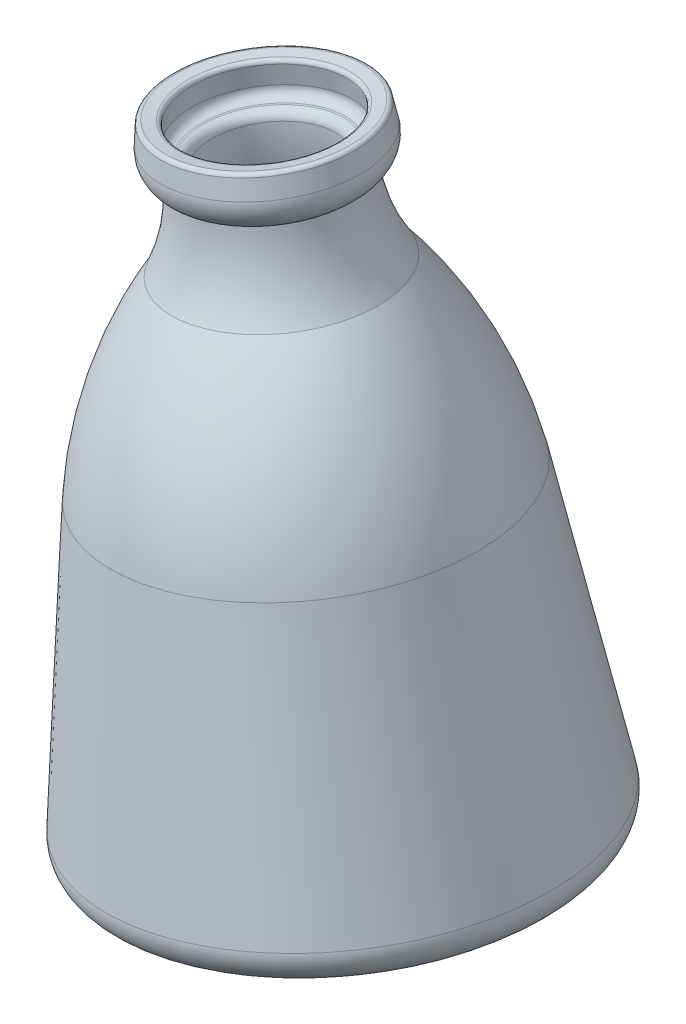
ISO-10303-21;
HEADER;
FILE_DESCRIPTION(('STEP AP214'),'2;1');
FILE_NAME('part.step','',(''),(''),'','','');
FILE_SCHEMA(('AUTOMOTIVE_DESIGN { 1 0 10303 214 1 1 1 1 }'));
ENDSEC;
DATA;
#1=APPLICATION_CONTEXT('core data for automotive mechanical design processes');
#2=APPLICATION_PROTOCOL_DEFINITION('international standard','automotive_design',2000,#1);
#3=PRODUCT_CONTEXT('',#1,'mechanical');
#4=PRODUCT('Part','Part','',(#3));
#5=PRODUCT_RELATED_PRODUCT_CATEGORY('part','',(#4));
#6=PRODUCT_DEFINITION_FORMATION('','',#4);
#7=PRODUCT_DEFINITION_CONTEXT('part definition',#1,'design');
#8=PRODUCT_DEFINITION('design','',#6,#7);
#9=PRODUCT_DEFINITION_SHAPE('','',#8);
#10=(LENGTH_UNIT() NAMED_UNIT(*) SI_UNIT(.MILLI.,.METRE.));
#11=(NAMED_UNIT(*) PLANE_ANGLE_UNIT() SI_UNIT($,.RADIAN.));
#12=(NAMED_UNIT(*) SI_UNIT($,.STERADIAN.) SOLID_ANGLE_UNIT());
#13=UNCERTAINTY_MEASURE_WITH_UNIT(LENGTH_MEASURE(1.E-05),#10,'distance_accuracy_value','');
#14=(GEOMETRIC_REPRESENTATION_CONTEXT(3) GLOBAL_UNCERTAINTY_ASSIGNED_CONTEXT((#13)) GLOBAL_UNIT_ASSIGNED_CONTEXT((#10,
#11,#12)) REPRESENTATION_CONTEXT('',''));
#15=CARTESIAN_POINT('',(0.,0.,0.));
#16=DIRECTION('',(0.,0.,1.));
#17=DIRECTION('',(1.,0.,0.));
#18=AXIS2_PLACEMENT_3D('',#15,#16,#17);
#19=CARTESIAN_POINT('',(39.3370164346481,15.7784016479815,0.));
#20=DIRECTION('',(0.138333615475444,-0.990385687916325,0.));
#21=DIRECTION('',(0.990385687916325,0.138333615475444,0.));
#22=AXIS2_PLACEMENT_3D('',#19,#20,#21);
#23=TOROIDAL_SURFACE('',#22,41.7707465623852,2.);
#24=CARTESIAN_POINT('',(39.0630091687989,17.7401292696405,0.));
#25=DIRECTION('',(0.138333615475444,-0.990385687916325,0.));
#26=DIRECTION('',(0.990385687916325,0.138333615475444,0.));
#27=AXIS2_PLACEMENT_3D('',#24,#25,#26);
#28=CIRCLE('',#27,41.4940793314343);
#29=CARTESIAN_POINT('',(80.158151471916,23.4801552843827,0.));
#30=VERTEX_POINT('',#29);
#31=EDGE_CURVE('E11',#30,#30,#28,.T.);
#32=ORIENTED_EDGE('',*,*,#31,.F.);
#33=EDGE_LOOP('',(#32));
#34=FACE_BOUND('',#33,.T.);
#35=CARTESIAN_POINT('',(39.3752888129891,15.5043943821322,0.));
#36=DIRECTION('',(0.138333615475444,-0.990385687916325,0.));
#37=DIRECTION('',(0.990385687916325,0.138333615475444,0.));
#38=AXIS2_PLACEMENT_3D('',#35,#36,#37);
#39=CIRCLE('',#38,39.7899751865526);
#40=CARTESIAN_POINT('',(78.7827107602964,21.0086855093663,0.));
#41=VERTEX_POINT('',#40);
#42=EDGE_CURVE('E168',#41,#41,#39,.T.);
#43=ORIENTED_EDGE('',*,*,#42,.T.);
#44=EDGE_LOOP('',(#43));
#45=FACE_BOUND('',#44,.T.);
#46=ADVANCED_FACE('F36',(#34,#45),#23,.T.);
#47=CARTESIAN_POINT('',(39.0630091687989,17.7401292696405,0.));
#48=DIRECTION('',(-0.138333615475444,0.990385687916325,0.));
#49=DIRECTION('',(-0.990385687916325,-0.138333615475444,0.));
#50=AXIS2_PLACEMENT_3D('',#47,#48,#49);
#51=CONICAL_SURFACE('',#50,41.4940793314343,1.43201767183175);
#52=CARTESIAN_POINT('',(38.9481920337758,18.5621510671881,0.));
#53=DIRECTION('',(0.138333615475444,-0.990385687916325,0.));
#54=DIRECTION('',(0.990385687916325,0.138333615475444,0.));
#55=AXIS2_PLACEMENT_3D('',#52,#53,#54);
#56=CIRCLE('',#55,47.4363934589323);
#57=CARTESIAN_POINT('',(85.9285172018699,25.1241988794779,0.));
#58=VERTEX_POINT('',#57);
#59=EDGE_CURVE('E43',#58,#58,#56,.T.);
#60=ORIENTED_EDGE('',*,*,#59,.F.);
#61=EDGE_LOOP('',(#60));
#62=FACE_BOUND('',#61,.T.);
#63=ORIENTED_EDGE('',*,*,#31,.T.);
#64=EDGE_LOOP('',(#63));
#65=FACE_BOUND('',#64,.T.);
#66=ADVANCED_FACE('F226',(#62,#65),#51,.F.);
#67=CARTESIAN_POINT('',(39.222199299625,16.6004234455291,0.));
#68=DIRECTION('',(0.138333615475444,-0.990385687916325,0.));
#69=DIRECTION('',(0.990385687916325,0.138333615475444,0.));
#70=AXIS2_PLACEMENT_3D('',#67,#68,#69);
#71=TOROIDAL_SURFACE('',#70,47.7130606898832,2.);
#72=CARTESIAN_POINT('',(39.183926921284,16.8744307113783,0.));
#73=DIRECTION('',(0.138333615475444,-0.990385687916325,0.));
#74=DIRECTION('',(0.990385687916325,0.138333615475444,0.));
#75=AXIS2_PLACEMENT_3D('',#72,#73,#74);
#76=CIRCLE('',#75,49.6938320657158);
#77=CARTESIAN_POINT('',(88.3999869768863,23.7487581678583,0.));
#78=VERTEX_POINT('',#77);
#79=EDGE_CURVE('E219',#78,#78,#76,.T.);
#80=ORIENTED_EDGE('',*,*,#79,.F.);
#81=EDGE_LOOP('',(#80));
#82=FACE_BOUND('',#81,.T.);
#83=ORIENTED_EDGE('',*,*,#59,.T.);
#84=EDGE_LOOP('',(#83));
#85=FACE_BOUND('',#84,.T.);
#86=ADVANCED_FACE('F224',(#82,#85),#71,.T.);
#87=CARTESIAN_POINT('',(39.183926921284,16.8744307113783,0.));
#88=DIRECTION('',(0.138333615475444,-0.990385687916325,0.));
#89=DIRECTION('',(0.990385687916325,0.138333615475444,0.));
#90=AXIS2_PLACEMENT_3D('',#87,#88,#89);
#91=CONICAL_SURFACE('',#90,49.6938320657158,0.13877865496315);
#92=CARTESIAN_POINT('',(40.55396325053,7.06579260308338,0.));
#93=DIRECTION('',(0.138333615475444,-0.990385687916325,0.));
#94=DIRECTION('',(0.990385687916325,0.138333615475444,0.));
#95=AXIS2_PLACEMENT_3D('',#92,#93,#94);
#96=CIRCLE('',#95,51.0771682204702);
#97=CARTESIAN_POINT('',(91.1400596353783,14.1314819512685,0.));
#98=VERTEX_POINT('',#97);
#99=EDGE_CURVE('E216',#98,#98,#96,.T.);
#100=ORIENTED_EDGE('',*,*,#99,.F.);
#101=EDGE_LOOP('',(#100));
#102=FACE_BOUND('',#101,.T.);
#103=ORIENTED_EDGE('',*,*,#79,.T.);
#104=EDGE_LOOP('',(#103));
#105=FACE_BOUND('',#104,.T.);
#106=ADVANCED_FACE('F319',(#102,#105),#91,.T.);
#107=CARTESIAN_POINT('',(40.8410060880876,5.01073810921435,0.));
#108=DIRECTION('',(0.138333615475444,-0.990385687916325,0.));
#109=DIRECTION('',(0.990385687916325,0.138333615475444,0.));
#110=AXIS2_PLACEMENT_3D('',#107,#108,#109);
#111=TOROIDAL_SURFACE('',#110,36.2213829017254,15.);
#112=CARTESIAN_POINT('',(42.7785090361819,-8.86062051531988,0.));
#113=DIRECTION('',(0.138333615475444,-0.990385687916325,0.));
#114=DIRECTION('',(0.990385687916325,0.138333615475444,0.));
#115=AXIS2_PLACEMENT_3D('',#112,#113,#114);
#116=CIRCLE('',#115,41.5908793618865);
#117=CARTESIAN_POINT('',(83.9695207040488,-3.1072038023871,0.));
#118=VERTEX_POINT('',#117);
#119=EDGE_CURVE('E213',#118,#118,#116,.T.);
#120=ORIENTED_EDGE('',*,*,#119,.F.);
#121=EDGE_LOOP('',(#120));
#122=FACE_BOUND('',#121,.T.);
#123=ORIENTED_EDGE('',*,*,#99,.T.);
#124=EDGE_LOOP('',(#123));
#125=FACE_BOUND('',#124,.T.);
#126=ADVANCED_FACE('F315',(#122,#125),#111,.T.);
#127=CARTESIAN_POINT('',(42.4731771639399,-6.67462750636158,0.));
#128=DIRECTION('',(0.138333615475444,-0.990385687916325,0.));
#129=DIRECTION('',(0.990385687916325,0.138333615475444,0.));
#130=AXIS2_PLACEMENT_3D('',#127,#128,#129);
#131=TOROIDAL_SURFACE('',#130,131.563809774387,90.);
#132=CARTESIAN_POINT('',(48.5307409426701,-50.0431496799162,0.));
#133=DIRECTION('',(0.138333615475444,-0.990385687916325,0.));
#134=DIRECTION('',(0.990385687916325,0.138333615475444,0.));
#135=AXIS2_PLACEMENT_3D('',#132,#133,#134);
#136=CIRCLE('',#135,52.9350796209082);
#137=CARTESIAN_POINT('',(100.956886187929,-42.7204487304755,0.));
#138=VERTEX_POINT('',#137);
#139=EDGE_CURVE('E210',#138,#138,#136,.T.);
#140=ORIENTED_EDGE('',*,*,#139,.F.);
#141=EDGE_LOOP('',(#140));
#142=FACE_BOUND('',#141,.T.);
#143=ORIENTED_EDGE('',*,*,#119,.T.);
#144=EDGE_LOOP('',(#143));
#145=FACE_BOUND('',#144,.T.);
#146=ADVANCED_FACE('F311',(#142,#145),#131,.F.);
#147=CARTESIAN_POINT('',(66.2307969395237,-176.764930747751,0.));
#148=DIRECTION('',(0.138333615475444,-0.990385687916325,0.));
#149=DIRECTION('',(0.990385687916325,0.138333615475444,0.));
#150=AXIS2_PLACEMENT_3D('',#147,#148,#149);
#151=DEGENERATE_TOROIDAL_SURFACE('',#150,113.583082213481,210.,.F.);
#152=CARTESIAN_POINT('',(61.6894632029249,-144.251705951878,0.));
#153=DIRECTION('',(0.138333615475444,-0.990385687916325,0.));
#154=DIRECTION('',(0.990385687916325,0.138333615475444,0.));
#155=AXIS2_PLACEMENT_3D('',#152,#153,#154);
#156=CIRCLE('',#155,93.8350136732225);
#157=CARTESIAN_POINT('',(154.622317770317,-131.271169252273,0.));
#158=VERTEX_POINT('',#157);
#159=EDGE_CURVE('E207',#158,#158,#156,.T.);
#160=ORIENTED_EDGE('',*,*,#159,.F.);
#161=EDGE_LOOP('',(#160));
#162=FACE_BOUND('',#161,.T.);
#163=ORIENTED_EDGE('',*,*,#139,.T.);
#164=EDGE_LOOP('',(#163));
#165=FACE_BOUND('',#164,.T.);
#166=ADVANCED_FACE('F307',(#162,#165),#151,.F.);
#167=CARTESIAN_POINT('',(61.6894632029249,-144.251705951878,0.));
#168=DIRECTION('',(0.138333615475444,-0.990385687916325,0.));
#169=DIRECTION('',(0.990385687916325,0.138333615475444,0.));
#170=AXIS2_PLACEMENT_3D('',#167,#168,#169);
#171=CONICAL_SURFACE('',#170,93.8350136732225,0.138778654963151);
#172=CARTESIAN_POINT('',(79.5527487690849,-256.666494732534,-8.93485225696441));
#173=DIRECTION('',(0.,0.866025403784439,-0.499999999999999));
#174=DIRECTION('',(0.269052053439782,-0.481562818472272,-0.834091268630045));
#175=AXIS2_PLACEMENT_3D('',#172,#173,#174);
#176=ELLIPSE('',#175,127.936362662556,109.345591264937);
#177=CARTESIAN_POINT('',(-31.2050662316217,-253.170081953854,-2.87888768005868));
#178=VERTEX_POINT('',#177);
#179=CARTESIAN_POINT('',(-28.8329270824359,-264.717087353855,-22.8788877081311));
#180=VERTEX_POINT('',#179);
#181=EDGE_CURVE('E470',#178,#180,#176,.F.);
#182=ORIENTED_EDGE('',*,*,#181,.F.);
#183=CARTESIAN_POINT('',(80.0294696432251,-260.012943455791,8.97329611045188));
#184=DIRECTION('',(0.,0.866025403784435,0.500000000000006));
#185=DIRECTION('',(0.269052053439778,-0.481562818472279,0.834091268630042));
#186=AXIS2_PLACEMENT_3D('',#183,#184,#185);
#187=ELLIPSE('',#186,128.486832512583,109.816070884429);
#188=CARTESIAN_POINT('',(-29.8999848280213,-264.717087353855,17.1211123480134));
#189=VERTEX_POINT('',#188);
#190=EDGE_CURVE('E156',#189,#178,#187,.F.);
#191=ORIENTED_EDGE('',*,*,#190,.F.);
#192=CARTESIAN_POINT('',(-29.9992118488496,-326.663361661264,17.1211123480134));
#193=CARTESIAN_POINT('',(-29.9867541502219,-318.2634806968,17.1211123480134));
#194=CARTESIAN_POINT('',(-29.9739235071269,-309.863600277777,17.1211123480134));
#195=CARTESIAN_POINT('',(-29.9474364100436,-293.063840842087,17.1211123480134));
#196=CARTESIAN_POINT('',(-29.9337799560649,-284.663961825419,17.1211123480134));
#197=CARTESIAN_POINT('',(-29.9055613149359,-267.864205290529,17.1211123480135));
#198=CARTESIAN_POINT('',(-29.8909991277839,-259.464327772308,17.1211123480135));
#199=CARTESIAN_POINT('',(-29.8608718044595,-242.664574437315,17.1211123480135));
#200=CARTESIAN_POINT('',(-29.8453066682754,-234.264698620544,17.1211123480135));
#201=CARTESIAN_POINT('',(-29.8291914498084,-225.864823846445,17.1211123480135));
#202=B_SPLINE_CURVE_WITH_KNOTS('',3,(#192,#193,#194,#195,#196,#197,#198,#199,#200,#201),
.UNSPECIFIED.,.F.,.F.,(4,2,2,2,4),(0.,25.1996706097191,50.3993409223125,75.5990112867886,
100.79868194854),.UNSPECIFIED.);
#203=CARTESIAN_POINT('',(-29.9387846117348,-287.811098153855,17.1211123480134));
#204=VERTEX_POINT('',#203);
#205=EDGE_CURVE('E147',#204,#189,#202,.T.);
#206=ORIENTED_EDGE('',*,*,#205,.F.);
#207=CARTESIAN_POINT('',(86.1764302431691,-303.162907234263,-9.46900096735091));
#208=DIRECTION('',(0.,-0.866025403784439,0.5));
#209=DIRECTION('',(0.269052053439781,-0.481562818472273,-0.834091268630045));
#210=AXIS2_PLACEMENT_3D('',#207,#208,#209);
#211=ELLIPSE('',#210,135.584731226733,115.882555154304);
#212=CARTESIAN_POINT('',(-31.2072244699228,-299.358103553855,-2.87888768005881));
#213=VERTEX_POINT('',#212);
#214=EDGE_CURVE('E155',#213,#204,#211,.F.);
#215=ORIENTED_EDGE('',*,*,#214,.F.);
#216=CARTESIAN_POINT('',(86.6531511173093,-306.50935595752,9.50744482083822));
#217=DIRECTION('',(0.,-0.866025403784439,-0.5));
#218=DIRECTION('',(0.269052053439781,-0.481562818472273,0.834091268630045));
#219=AXIS2_PLACEMENT_3D('',#216,#217,#218);
#220=ELLIPSE('',#219,136.13520107676,116.353034773796);
#221=CARTESIAN_POINT('',(-28.9031937715438,-287.811098153855,-22.8788877081311));
#222=VERTEX_POINT('',#221);
#223=EDGE_CURVE('E102',#222,#213,#220,.F.);
#224=ORIENTED_EDGE('',*,*,#223,.F.);
#225=CARTESIAN_POINT('',(-28.7045637537887,-225.864823846445,-22.8788877081311));
#226=CARTESIAN_POINT('',(-28.7338073854322,-234.264690740697,-22.8788877081311));
#227=CARTESIAN_POINT('',(-28.7620368881003,-242.664561121812,-22.8788877081311));
#228=CARTESIAN_POINT('',(-28.8166500204207,-259.464307556876,-22.8788877081311));
#229=CARTESIAN_POINT('',(-28.8430336501465,-267.864183610826,-22.8788877081311));
#230=CARTESIAN_POINT('',(-28.8941374236388,-284.663940700934,-22.8788877081311));
#231=CARTESIAN_POINT('',(-28.9188575674169,-293.063821737091,-22.8788877081311));
#232=CARTESIAN_POINT('',(-28.9667836149504,-309.863588467972,-22.8788877081311));
#233=CARTESIAN_POINT('',(-28.9899895186454,-318.263474162695,-22.8788877081311));
#234=CARTESIAN_POINT('',(-29.0125129241915,-326.663361661264,-22.8788877081311));
#235=B_SPLINE_CURVE_WITH_KNOTS('',3,(#225,#226,#227,#228,#229,#230,#231,#232,#233,#234),
.UNSPECIFIED.,.F.,.F.,(4,2,2,2,4),(0.,25.1997532729952,50.3995055426008,75.5992576362188,
100.799010732693),.UNSPECIFIED.);
#236=EDGE_CURVE('E50',#180,#222,#235,.T.);
#237=ORIENTED_EDGE('',*,*,#236,.F.);
#238=EDGE_LOOP('',(#182,#191,#206,#215,#224,#237));
#239=FACE_BOUND('',#238,.T.);
#240=CARTESIAN_POINT('',(81.5676049124929,-286.567273891497,0.));
#241=DIRECTION('',(0.138333615475444,-0.990385687916325,0.));
#242=DIRECTION('',(0.990385687916325,0.138333615475444,0.));
#243=AXIS2_PLACEMENT_3D('',#240,#241,#242);
#244=CIRCLE('',#243,113.906125313971);
#245=CARTESIAN_POINT('',(194.378601189453,-270.810227752017,0.));
#246=VERTEX_POINT('',#245);
#247=EDGE_CURVE('E204',#246,#246,#244,.T.);
#248=ORIENTED_EDGE('',*,*,#247,.F.);
#249=EDGE_LOOP('',(#248));
#250=FACE_BOUND('',#249,.T.);
#251=ORIENTED_EDGE('',*,*,#159,.T.);
#252=EDGE_LOOP('',(#251));
#253=FACE_BOUND('',#252,.T.);
#254=ADVANCED_FACE('F303',(#239,#250,#253),#171,.T.);
#255=CARTESIAN_POINT('',(81.8546477500505,-288.622328385366,0.));
#256=DIRECTION('',(0.138333615475444,-0.990385687916325,0.));
#257=DIRECTION('',(0.990385687916325,0.138333615475444,0.));
#258=AXIS2_PLACEMENT_3D('',#255,#256,#257);
#259=TOROIDAL_SURFACE('',#258,99.0503399952261,15.);
#260=CARTESIAN_POINT('',(83.9097022439195,-303.335285547809,0.));
#261=DIRECTION('',(0.138333615475444,-0.990385687916325,0.));
#262=DIRECTION('',(0.990385687916325,0.138333615475444,0.));
#263=AXIS2_PLACEMENT_3D('',#260,#261,#262);
#264=CIRCLE('',#263,101.125344227358);
#265=CARTESIAN_POINT('',(184.062795852306,-289.346251064639,0.));
#266=VERTEX_POINT('',#265);
#267=EDGE_CURVE('E201',#266,#266,#264,.T.);
#268=ORIENTED_EDGE('',*,*,#267,.F.);
#269=EDGE_LOOP('',(#268));
#270=FACE_BOUND('',#269,.T.);
#271=ORIENTED_EDGE('',*,*,#247,.T.);
#272=EDGE_LOOP('',(#271));
#273=FACE_BOUND('',#272,.T.);
#274=ADVANCED_FACE('F299',(#270,#273),#259,.T.);
#275=CARTESIAN_POINT('',(83.9097022439195,-303.335285547809,0.));
#276=DIRECTION('',(-0.138333615475444,0.990385687916325,0.));
#277=DIRECTION('',(-0.990385687916325,-0.138333615475444,0.));
#278=AXIS2_PLACEMENT_3D('',#275,#276,#277);
#279=CONICAL_SURFACE('',#278,101.125344227358,1.43201767183175);
#280=CARTESIAN_POINT('',(84.90507479991,-310.461555834387,0.));
#281=DIRECTION('',(0.138333615475444,-0.990385687916325,0.));
#282=DIRECTION('',(0.990385687916325,0.138333615475444,0.));
#283=AXIS2_PLACEMENT_3D('',#280,#281,#282);
#284=CIRCLE('',#283,49.6102424056787);
#285=CARTESIAN_POINT('',(134.038348852554,-303.598791637796,0.));
#286=VERTEX_POINT('',#285);
#287=EDGE_CURVE('E198',#286,#286,#284,.T.);
#288=ORIENTED_EDGE('',*,*,#287,.F.);
#289=EDGE_LOOP('',(#288));
#290=FACE_BOUND('',#289,.T.);
#291=ORIENTED_EDGE('',*,*,#267,.T.);
#292=EDGE_LOOP('',(#291));
#293=FACE_BOUND('',#292,.T.);
#294=ADVANCED_FACE('F293',(#290,#293),#279,.T.);
#295=CARTESIAN_POINT('',(110.276690764159,-492.107103403857,0.));
#296=DIRECTION('',(0.138333615475444,-0.990385687916325,0.));
#297=DIRECTION('',(-0.990385687916325,-0.138333615475444,0.));
#298=AXIS2_PLACEMENT_3D('',#295,#296,#297);
#299=SPHERICAL_SURFACE('',#298,190.);
#300=ORIENTED_EDGE('',*,*,#287,.T.);
#301=EDGE_LOOP('',(#300));
#302=FACE_BOUND('',#301,.T.);
#303=ADVANCED_FACE('F288',(#302),#299,.F.);
#304=CARTESIAN_POINT('',(110.276690764159,-492.107103403857,0.));
#305=DIRECTION('',(0.138333615475444,-0.990385687916325,0.));
#306=DIRECTION('',(-0.990385687916325,-0.138333615475444,0.));
#307=AXIS2_PLACEMENT_3D('',#304,#305,#306);
#308=SPHERICAL_SURFACE('',#307,200.);
#309=CARTESIAN_POINT('',(83.4964753731989,-300.376829085744,0.));
#310=DIRECTION('',(0.138333615475444,-0.990385687916325,0.));
#311=DIRECTION('',(0.990385687916325,0.138333615475444,0.));
#312=AXIS2_PLACEMENT_3D('',#309,#310,#311);
#313=CIRCLE('',#312,50.222723676787);
#314=CARTESIAN_POINT('',(133.236342110865,-293.42933814051,0.));
#315=VERTEX_POINT('',#314);
#316=EDGE_CURVE('E195',#315,#315,#313,.T.);
#317=ORIENTED_EDGE('',*,*,#316,.F.);
#318=EDGE_LOOP('',(#317));
#319=FACE_BOUND('',#318,.T.);
#320=ADVANCED_FACE('F283',(#319),#308,.T.);
#321=CARTESIAN_POINT('',(83.4964753731989,-300.376829085744,0.));
#322=DIRECTION('',(-0.138333615475444,0.990385687916325,0.));
#323=DIRECTION('',(-0.990385687916325,-0.138333615475444,0.));
#324=AXIS2_PLACEMENT_3D('',#321,#322,#323);
#325=CONICAL_SURFACE('',#324,50.222723676787,1.43201767183175);
#326=CARTESIAN_POINT('',(82.5396659146735,-293.526647439514,0.));
#327=DIRECTION('',(0.138333615475444,-0.990385687916325,0.));
#328=DIRECTION('',(0.990385687916325,0.138333615475444,0.));
#329=AXIS2_PLACEMENT_3D('',#326,#327,#328);
#330=CIRCLE('',#329,99.7420080726033);
#331=CARTESIAN_POINT('',(181.322723193814,-279.728974848049,0.));
#332=VERTEX_POINT('',#331);
#333=EDGE_CURVE('E192',#332,#332,#330,.T.);
#334=ORIENTED_EDGE('',*,*,#333,.F.);
#335=EDGE_LOOP('',(#334));
#336=FACE_BOUND('',#335,.T.);
#337=ORIENTED_EDGE('',*,*,#316,.T.);
#338=EDGE_LOOP('',(#337));
#339=FACE_BOUND('',#338,.T.);
#340=ADVANCED_FACE('F277',(#336,#339),#325,.F.);
#341=CARTESIAN_POINT('',(81.8546477500505,-288.622328385366,0.));
#342=DIRECTION('',(0.138333615475444,-0.990385687916325,0.));
#343=DIRECTION('',(0.990385687916325,0.138333615475444,0.));
#344=AXIS2_PLACEMENT_3D('',#341,#342,#343);
#345=TOROIDAL_SURFACE('',#344,99.0503399952261,5.);
#346=CARTESIAN_POINT('',(81.758966804198,-287.937310220743,0.));
#347=DIRECTION('',(0.138333615475444,-0.990385687916325,0.));
#348=DIRECTION('',(0.990385687916325,0.138333615475444,0.));
#349=AXIS2_PLACEMENT_3D('',#346,#347,#348);
#350=CIRCLE('',#349,104.002268434808);
#351=CARTESIAN_POINT('',(184.761324972863,-273.550300410509,0.));
#352=VERTEX_POINT('',#351);
#353=EDGE_CURVE('E189',#352,#352,#350,.T.);
#354=ORIENTED_EDGE('',*,*,#353,.F.);
#355=EDGE_LOOP('',(#354));
#356=FACE_BOUND('',#355,.T.);
#357=ORIENTED_EDGE('',*,*,#333,.T.);
#358=EDGE_LOOP('',(#357));
#359=FACE_BOUND('',#358,.T.);
#360=ADVANCED_FACE('F271',(#356,#359),#345,.F.);
#361=CARTESIAN_POINT('',(81.758966804198,-287.937310220743,0.));
#362=DIRECTION('',(0.138333615475444,-0.990385687916325,0.));
#363=DIRECTION('',(0.990385687916325,0.138333615475444,0.));
#364=AXIS2_PLACEMENT_3D('',#361,#362,#363);
#365=CONICAL_SURFACE('',#364,104.002268434808,0.13877865496315);
#366=CARTESIAN_POINT('',(-19.6943395190778,-233.338311677217,17.1211123480135));
#367=CARTESIAN_POINT('',(-19.7108300977543,-240.492604584899,17.1211123480134));
#368=CARTESIAN_POINT('',(-19.7267936181784,-247.6468986945,17.1211123480134));
#369=CARTESIAN_POINT('',(-19.7577546198586,-261.955488896869,17.1211123480134));
#370=CARTESIAN_POINT('',(-19.7727521011295,-269.109784989637,17.1211123480134));
#371=CARTESIAN_POINT('',(-19.8018691023016,-283.418378938091,17.1211123480134));
#372=CARTESIAN_POINT('',(-19.815988622205,-290.572676793777,17.1211123480134));
#373=CARTESIAN_POINT('',(-19.8434229503038,-304.881274158509,17.1211123480134));
#374=CARTESIAN_POINT('',(-19.8567377584869,-312.035573667556,17.1211123480134));
#375=CARTESIAN_POINT('',(-19.8696868354066,-319.189873830492,17.1211123480134));
#376=B_SPLINE_CURVE_WITH_KNOTS('',3,(#366,#367,#368,#369,#370,#371,#372,#373,#374,#375),
.UNSPECIFIED.,.F.,.F.,(4,2,2,2,4),(0.,21.4629357008638,42.9258710743249,64.3888063942339,
85.8517420414086),.UNSPECIFIED.);
#377=CARTESIAN_POINT('',(-19.7634249303997,-264.717087353855,17.1211123480134));
#378=VERTEX_POINT('',#377);
#379=CARTESIAN_POINT('',(-19.8104323163586,-287.811098153855,17.1211123480134));
#380=VERTEX_POINT('',#379);
#381=EDGE_CURVE('E130',#378,#380,#376,.T.);
#382=ORIENTED_EDGE('',*,*,#381,.F.);
#383=CARTESIAN_POINT('',(79.7623952884068,-259.534920421201,8.14533592735348));
#384=DIRECTION('',(0.,0.866025403784435,0.500000000000006));
#385=DIRECTION('',(0.269052053439778,-0.481562818472279,0.834091268630042));
#386=AXIS2_PLACEMENT_3D('',#383,#384,#385);
#387=ELLIPSE('',#386,116.631436227494,99.6834136047125);
#388=CARTESIAN_POINT('',(-21.2011597570756,-253.170081953854,-2.87888768005868));
#389=VERTEX_POINT('',#388);
#390=EDGE_CURVE('E112',#389,#378,#387,.T.);
#391=ORIENTED_EDGE('',*,*,#390,.F.);
#392=CARTESIAN_POINT('',(79.2856744142665,-256.188471697944,-8.10689207386603));
#393=DIRECTION('',(0.,0.866025403784439,-0.499999999999999));
#394=DIRECTION('',(0.269052053439782,-0.481562818472272,-0.834091268630045));
#395=AXIS2_PLACEMENT_3D('',#392,#393,#394);
#396=ELLIPSE('',#395,116.080966377467,99.2129339852206);
#397=CARTESIAN_POINT('',(-18.5851258857182,-264.717087353855,-22.8788877081311));
#398=VERTEX_POINT('',#397);
#399=EDGE_CURVE('E110',#398,#389,#396,.T.);
#400=ORIENTED_EDGE('',*,*,#399,.F.);
#401=CARTESIAN_POINT('',(-18.7780155672292,-319.189873830492,-22.8788877081311));
#402=CARTESIAN_POINT('',(-18.7545387637458,-312.035565865232,-22.8788877081311));
#403=CARTESIAN_POINT('',(-18.7303889424221,-304.881260080447,-22.8788877081311));
#404=CARTESIAN_POINT('',(-18.6806051351196,-290.572654052206,-22.8788877081311));
#405=CARTESIAN_POINT('',(-18.6549711492181,-283.41835380875,-22.8788877081311));
#406=CARTESIAN_POINT('',(-18.6020808811413,-269.109759236772,-22.8788877081311));
#407=CARTESIAN_POINT('',(-18.5748245989521,-261.955464908249,-22.8788877081311));
#408=CARTESIAN_POINT('',(-18.5185227575887,-247.646882925787,-22.8788877081311));
#409=CARTESIAN_POINT('',(-18.4894771983211,-240.492595271847,-22.8788877081311));
#410=CARTESIAN_POINT('',(-18.4594535114666,-233.338311677217,-22.8788877081311));
#411=B_SPLINE_CURVE_WITH_KNOTS('',3,(#401,#402,#403,#404,#405,#406,#407,#408,#409,#410),
.UNSPECIFIED.,.F.,.F.,(4,2,2,2,4),(0.,21.4630394623393,42.9260778065487,64.3891163348394,
85.8521559817583),.UNSPECIFIED.);
#412=CARTESIAN_POINT('',(-18.6705145192325,-287.811098153855,-22.8788877081311));
#413=VERTEX_POINT('',#412);
#414=EDGE_CURVE('E90',#413,#398,#411,.T.);
#415=ORIENTED_EDGE('',*,*,#414,.F.);
#416=CARTESIAN_POINT('',(86.386076762491,-306.03133292293,8.67948463773981));
#417=DIRECTION('',(0.,-0.866025403784439,-0.5));
#418=DIRECTION('',(0.269052053439781,-0.481562818472273,0.834091268630045));
#419=AXIS2_PLACEMENT_3D('',#416,#417,#418);
#420=ELLIPSE('',#419,124.279804791671,106.22037749408);
#421=CARTESIAN_POINT('',(-21.2037655229,-299.358103553855,-2.8788876800588));
#422=VERTEX_POINT('',#421);
#423=EDGE_CURVE('E99',#422,#413,#420,.T.);
#424=ORIENTED_EDGE('',*,*,#423,.F.);
#425=CARTESIAN_POINT('',(85.9093558883507,-302.684884199673,-8.6410407842525));
#426=DIRECTION('',(0.,-0.866025403784439,0.5));
#427=DIRECTION('',(0.269052053439781,-0.481562818472273,-0.834091268630045));
#428=AXIS2_PLACEMENT_3D('',#425,#426,#427);
#429=ELLIPSE('',#428,123.729334941645,105.749897874588);
#430=EDGE_CURVE('E58',#380,#422,#429,.T.);
#431=ORIENTED_EDGE('',*,*,#430,.F.);
#432=EDGE_LOOP('',(#382,#391,#400,#415,#424,#431));
#433=FACE_BOUND('',#432,.T.);
#434=CARTESIAN_POINT('',(61.893440030131,-145.712057650467,0.));
#435=DIRECTION('',(0.138333615475444,-0.990385687916325,0.));
#436=DIRECTION('',(0.990385687916325,0.138333615475444,0.));
#437=AXIS2_PLACEMENT_3D('',#434,#435,#436);
#438=CIRCLE('',#437,83.9438941908683);
#439=CARTESIAN_POINT('',(145.030271424729,-134.099795269956,0.));
#440=VERTEX_POINT('',#439);
#441=EDGE_CURVE('E186',#440,#440,#438,.T.);
#442=ORIENTED_EDGE('',*,*,#441,.F.);
#443=EDGE_LOOP('',(#442));
#444=FACE_BOUND('',#443,.T.);
#445=ORIENTED_EDGE('',*,*,#353,.T.);
#446=EDGE_LOOP('',(#445));
#447=FACE_BOUND('',#446,.T.);
#448=ADVANCED_FACE('F106',(#433,#444,#447),#365,.F.);
#449=CARTESIAN_POINT('',(66.2307969395237,-176.764930747751,0.));
#450=DIRECTION('',(0.138333615475444,-0.990385687916325,0.));
#451=DIRECTION('',(0.990385687916325,0.138333615475444,0.));
#452=AXIS2_PLACEMENT_3D('',#449,#450,#451);
#453=DEGENERATE_TOROIDAL_SURFACE('',#452,113.583082213481,200.,.F.);
#454=CARTESIAN_POINT('',(49.2960373003191,-55.5222124299577,0.));
#455=DIRECTION('',(0.138333615475444,-0.990385687916325,0.));
#456=DIRECTION('',(0.990385687916325,0.138333615475444,0.));
#457=AXIS2_PLACEMENT_3D('',#454,#455,#456);
#458=CIRCLE('',#457,44.5732239234368);
#459=CARTESIAN_POINT('',(93.4407203383805,-49.3562372112321,0.));
#460=VERTEX_POINT('',#459);
#461=EDGE_CURVE('E183',#460,#460,#458,.T.);
#462=ORIENTED_EDGE('',*,*,#461,.F.);
#463=EDGE_LOOP('',(#462));
#464=FACE_BOUND('',#463,.T.);
#465=ORIENTED_EDGE('',*,*,#441,.T.);
#466=EDGE_LOOP('',(#465));
#467=FACE_BOUND('',#466,.T.);
#468=ADVANCED_FACE('F261',(#464,#467),#453,.T.);
#469=CARTESIAN_POINT('',(42.4731771639399,-6.67462750636158,0.));
#470=DIRECTION('',(0.138333615475444,-0.990385687916325,0.));
#471=DIRECTION('',(0.990385687916325,0.138333615475444,0.));
#472=AXIS2_PLACEMENT_3D('',#469,#470,#471);
#473=TOROIDAL_SURFACE('',#472,131.563809774387,100.);
#474=CARTESIAN_POINT('',(42.2180882650915,-4.84834404158341,0.));
#475=DIRECTION('',(0.138333615475444,-0.990385687916325,0.));
#476=DIRECTION('',(0.990385687916325,0.138333615475444,0.));
#477=AXIS2_PLACEMENT_3D('',#474,#475,#476);
#478=CIRCLE('',#477,31.580813128157);
#479=CARTESIAN_POINT('',(73.4952735999781,-0.479655981911088,0.));
#480=VERTEX_POINT('',#479);
#481=EDGE_CURVE('E180',#480,#480,#478,.T.);
#482=ORIENTED_EDGE('',*,*,#481,.F.);
#483=EDGE_LOOP('',(#482));
#484=FACE_BOUND('',#483,.T.);
#485=ORIENTED_EDGE('',*,*,#461,.T.);
#486=EDGE_LOOP('',(#485));
#487=FACE_BOUND('',#486,.T.);
#488=ADVANCED_FACE('F255',(#484,#487),#473,.T.);
#489=CARTESIAN_POINT('',(42.2308427100339,-4.93965821482231,0.));
#490=DIRECTION('',(0.138333615475444,-0.990385687916325,0.));
#491=DIRECTION('',(0.990385687916325,0.138333615475444,0.));
#492=AXIS2_PLACEMENT_3D('',#489,#490,#491);
#493=TOROIDAL_SURFACE('',#492,36.5799629604685,5.);
#494=CARTESIAN_POINT('',(41.5458245454109,-0.0353391606748299,0.));
#495=DIRECTION('',(0.138333615475444,-0.990385687916325,0.));
#496=DIRECTION('',(0.990385687916325,0.138333615475444,0.));
#497=AXIS2_PLACEMENT_3D('',#494,#495,#496);
#498=CIRCLE('',#497,35.8882948830912);
#499=CARTESIAN_POINT('',(77.0890781613451,4.92921842375206,0.));
#500=VERTEX_POINT('',#499);
#501=EDGE_CURVE('E177',#500,#500,#498,.T.);
#502=ORIENTED_EDGE('',*,*,#501,.F.);
#503=EDGE_LOOP('',(#502));
#504=FACE_BOUND('',#503,.T.);
#505=ORIENTED_EDGE('',*,*,#481,.T.);
#506=EDGE_LOOP('',(#505));
#507=FACE_BOUND('',#506,.T.);
#508=ADVANCED_FACE('F249',(#504,#507),#493,.T.);
#509=CARTESIAN_POINT('',(41.5458245454109,-0.0353391606748299,0.));
#510=DIRECTION('',(-0.138333615475444,0.990385687916325,0.));
#511=DIRECTION('',(-0.990385687916325,-0.138333615475444,0.));
#512=AXIS2_PLACEMENT_3D('',#509,#510,#511);
#513=CONICAL_SURFACE('',#512,35.8882948830912,1.43201767183169);
#514=CARTESIAN_POINT('',(41.5260242527106,0.106419055066975,0.));
#515=DIRECTION('',(0.138333615475444,-0.990385687916325,0.));
#516=DIRECTION('',(0.990385687916325,0.138333615475444,0.));
#517=AXIS2_PLACEMENT_3D('',#514,#515,#516);
#518=CIRCLE('',#517,36.9130509791026);
#519=CARTESIAN_POINT('',(78.0841816397395,5.21273485523561,0.));
#520=VERTEX_POINT('',#519);
#521=EDGE_CURVE('E174',#520,#520,#518,.T.);
#522=ORIENTED_EDGE('',*,*,#521,.F.);
#523=EDGE_LOOP('',(#522));
#524=FACE_BOUND('',#523,.T.);
#525=ORIENTED_EDGE('',*,*,#501,.T.);
#526=EDGE_LOOP('',(#525));
#527=FACE_BOUND('',#526,.T.);
#528=ADVANCED_FACE('F243',(#524,#527),#513,.F.);
#529=CARTESIAN_POINT('',(40.8410060880876,5.01073810921435,0.));
#530=DIRECTION('',(0.138333615475444,-0.990385687916325,0.));
#531=DIRECTION('',(0.990385687916325,0.138333615475444,0.));
#532=AXIS2_PLACEMENT_3D('',#529,#530,#531);
#533=TOROIDAL_SURFACE('',#532,36.2213829017254,5.);
#534=CARTESIAN_POINT('',(40.7453251422351,5.69575627383728,0.));
#535=DIRECTION('',(0.138333615475444,-0.990385687916325,0.));
#536=DIRECTION('',(0.990385687916325,0.138333615475444,0.));
#537=AXIS2_PLACEMENT_3D('',#534,#535,#536);
#538=CIRCLE('',#537,41.173311341307);
#539=CARTESIAN_POINT('',(81.5227834187884,11.3914092927764,0.));
#540=VERTEX_POINT('',#539);
#541=EDGE_CURVE('E171',#540,#540,#538,.T.);
#542=ORIENTED_EDGE('',*,*,#541,.F.);
#543=EDGE_LOOP('',(#542));
#544=FACE_BOUND('',#543,.T.);
#545=ORIENTED_EDGE('',*,*,#521,.T.);
#546=EDGE_LOOP('',(#545));
#547=FACE_BOUND('',#546,.T.);
#548=ADVANCED_FACE('F237',(#544,#547),#533,.F.);
#549=CARTESIAN_POINT('',(40.7453251422351,5.69575627383728,0.));
#550=DIRECTION('',(0.138333615475444,-0.990385687916325,0.));
#551=DIRECTION('',(0.990385687916325,0.138333615475444,0.));
#552=AXIS2_PLACEMENT_3D('',#549,#550,#551);
#553=CONICAL_SURFACE('',#552,41.173311341307,0.13877865496315);
#554=ORIENTED_EDGE('',*,*,#42,.F.);
#555=EDGE_LOOP('',(#554));
#556=FACE_BOUND('',#555,.T.);
#557=ORIENTED_EDGE('',*,*,#541,.T.);
#558=EDGE_LOOP('',(#557));
#559=FACE_BOUND('',#558,.T.);
#560=ADVANCED_FACE('F142',(#556,#559),#553,.F.);
#561=CARTESIAN_POINT('',(-31.2443913644673,-264.717087353855,17.1211123480134));
#562=DIRECTION('',(0.,0.,1.));
#563=DIRECTION('',(0.,-1.,0.));
#564=AXIS2_PLACEMENT_3D('',#561,#562,#563);
#565=PLANE('',#564);
#566=ORIENTED_EDGE('',*,*,#205,.T.);
#567=DIRECTION('',(1.,0.,0.));
#568=VECTOR('',#567,1.);
#569=CARTESIAN_POINT('',(-31.2443913644673,-264.717087353855,17.1211123480134));
#570=LINE('',#569,#568);
#571=EDGE_CURVE('E161',#189,#378,#570,.T.);
#572=ORIENTED_EDGE('',*,*,#571,.T.);
#573=ORIENTED_EDGE('',*,*,#381,.T.);
#574=DIRECTION('',(1.,0.,0.));
#575=VECTOR('',#574,1.);
#576=CARTESIAN_POINT('',(-31.2443913644673,-287.811098153855,17.1211123480134));
#577=LINE('',#576,#575);
#578=EDGE_CURVE('E103',#204,#380,#577,.T.);
#579=ORIENTED_EDGE('',*,*,#578,.F.);
#580=EDGE_LOOP('',(#566,#572,#573,#579));
#581=FACE_BOUND('',#580,.T.);
#582=ADVANCED_FACE('F138',(#581),#565,.F.);
#583=CARTESIAN_POINT('',(-31.2443913644673,-287.811098153855,-22.8788877081311));
#584=DIRECTION('',(0.,0.,-1.));
#585=DIRECTION('',(0.,1.,0.));
#586=AXIS2_PLACEMENT_3D('',#583,#584,#585);
#587=PLANE('',#586);
#588=ORIENTED_EDGE('',*,*,#236,.T.);
#589=DIRECTION('',(1.,0.,0.));
#590=VECTOR('',#589,1.);
#591=CARTESIAN_POINT('',(-31.2443913644673,-287.811098153855,-22.8788877081311));
#592=LINE('',#591,#590);
#593=EDGE_CURVE('E86',#222,#413,#592,.T.);
#594=ORIENTED_EDGE('',*,*,#593,.T.);
#595=ORIENTED_EDGE('',*,*,#414,.T.);
#596=DIRECTION('',(1.,0.,0.));
#597=VECTOR('',#596,1.);
#598=CARTESIAN_POINT('',(-31.2443913644673,-264.717087353855,-22.8788877081311));
#599=LINE('',#598,#597);
#600=EDGE_CURVE('E95',#180,#398,#599,.T.);
#601=ORIENTED_EDGE('',*,*,#600,.F.);
#602=EDGE_LOOP('',(#588,#594,#595,#601));
#603=FACE_BOUND('',#602,.T.);
#604=ADVANCED_FACE('F88',(#603),#587,.F.);
#605=CARTESIAN_POINT('',(-31.2443913644673,-287.811098153855,17.1211123480134));
#606=DIRECTION('',(0.,-0.866025403784439,0.5));
#607=DIRECTION('',(0.,-0.5,-0.866025403784439));
#608=AXIS2_PLACEMENT_3D('',#605,#606,#607);
#609=PLANE('',#608);
#610=ORIENTED_EDGE('',*,*,#214,.T.);
#611=ORIENTED_EDGE('',*,*,#578,.T.);
#612=ORIENTED_EDGE('',*,*,#430,.T.);
#613=DIRECTION('',(1.,0.,0.));
#614=VECTOR('',#613,1.);
#615=CARTESIAN_POINT('',(-31.2443913644673,-299.358103553855,-2.87888768005881));
#616=LINE('',#615,#614);
#617=EDGE_CURVE('E96',#213,#422,#616,.T.);
#618=ORIENTED_EDGE('',*,*,#617,.F.);
#619=EDGE_LOOP('',(#610,#611,#612,#618));
#620=FACE_BOUND('',#619,.T.);
#621=ADVANCED_FACE('F430',(#620),#609,.F.);
#622=CARTESIAN_POINT('',(-31.2443913644673,-253.170081953854,-2.87888768005868));
#623=DIRECTION('',(0.,0.866025403784435,0.500000000000006));
#624=DIRECTION('',(0.,-0.500000000000006,0.866025403784435));
#625=AXIS2_PLACEMENT_3D('',#622,#623,#624);
#626=PLANE('',#625);
#627=ORIENTED_EDGE('',*,*,#190,.T.);
#628=DIRECTION('',(1.,0.,0.));
#629=VECTOR('',#628,1.);
#630=CARTESIAN_POINT('',(-31.2443913644673,-253.170081953854,-2.87888768005868));
#631=LINE('',#630,#629);
#632=EDGE_CURVE('E163',#178,#389,#631,.T.);
#633=ORIENTED_EDGE('',*,*,#632,.T.);
#634=ORIENTED_EDGE('',*,*,#390,.T.);
#635=ORIENTED_EDGE('',*,*,#571,.F.);
#636=EDGE_LOOP('',(#627,#633,#634,#635));
#637=FACE_BOUND('',#636,.T.);
#638=ADVANCED_FACE('F144',(#637),#626,.F.);
#639=CARTESIAN_POINT('',(-31.2443913644673,-264.717087353855,-22.8788877081311));
#640=DIRECTION('',(0.,0.866025403784439,-0.499999999999999));
#641=DIRECTION('',(0.,0.499999999999999,0.866025403784439));
#642=AXIS2_PLACEMENT_3D('',#639,#640,#641);
#643=PLANE('',#642);
#644=ORIENTED_EDGE('',*,*,#181,.T.);
#645=ORIENTED_EDGE('',*,*,#600,.T.);
#646=ORIENTED_EDGE('',*,*,#399,.T.);
#647=ORIENTED_EDGE('',*,*,#632,.F.);
#648=EDGE_LOOP('',(#644,#645,#646,#647));
#649=FACE_BOUND('',#648,.T.);
#650=ADVANCED_FACE('F442',(#649),#643,.F.);
#651=CARTESIAN_POINT('',(-31.2443913644673,-299.358103553855,-2.87888768005881));
#652=DIRECTION('',(0.,-0.866025403784439,-0.5));
#653=DIRECTION('',(0.,0.5,-0.866025403784439));
#654=AXIS2_PLACEMENT_3D('',#651,#652,#653);
#655=PLANE('',#654);
#656=ORIENTED_EDGE('',*,*,#223,.T.);
#657=ORIENTED_EDGE('',*,*,#617,.T.);
#658=ORIENTED_EDGE('',*,*,#423,.T.);
#659=ORIENTED_EDGE('',*,*,#593,.F.);
#660=EDGE_LOOP('',(#656,#657,#658,#659));
#661=FACE_BOUND('',#660,.T.);
#662=ADVANCED_FACE('F100',(#661),#655,.F.);
#663=CLOSED_SHELL('',(#46,#66,#86,#106,#126,#146,#166,#254,#274,#294,#303,#320,#340,#360,#448,
#468,#488,#508,#528,#548,#560,#582,#604,#621,#638,#650,#662));
#664=MANIFOLD_SOLID_BREP('B2',#663);
#665=ADVANCED_BREP_SHAPE_REPRESENTATION('',(#18,#664),#14);
#666=SHAPE_DEFINITION_REPRESENTATION(#9,#665);
ENDSEC;
END-ISO-10303-21;
